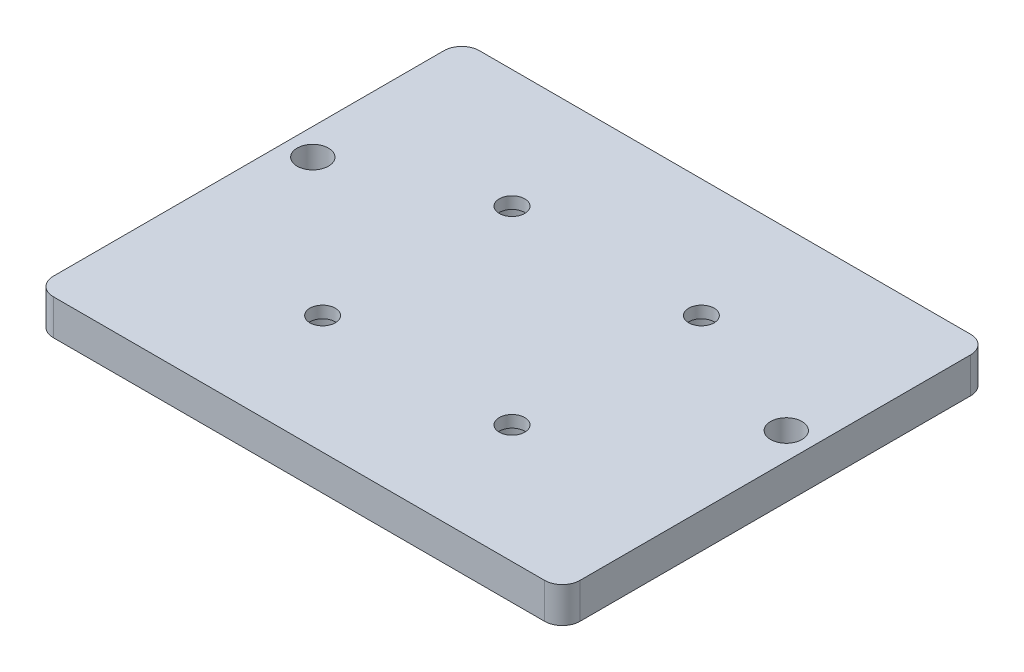
ISO-10303-21;
HEADER;
FILE_DESCRIPTION(('STEP AP214'),'2;1');
FILE_NAME('part.step','',(''),(''),'','','');
FILE_SCHEMA(('AUTOMOTIVE_DESIGN { 1 0 10303 214 1 1 1 1 }'));
ENDSEC;
DATA;
#1=APPLICATION_CONTEXT('core data for automotive mechanical design processes');
#2=APPLICATION_PROTOCOL_DEFINITION('international standard','automotive_design',2000,#1);
#3=PRODUCT_CONTEXT('',#1,'mechanical');
#4=PRODUCT('Part','Part','',(#3));
#5=PRODUCT_RELATED_PRODUCT_CATEGORY('part','',(#4));
#6=PRODUCT_DEFINITION_FORMATION('','',#4);
#7=PRODUCT_DEFINITION_CONTEXT('part definition',#1,'design');
#8=PRODUCT_DEFINITION('design','',#6,#7);
#9=PRODUCT_DEFINITION_SHAPE('','',#8);
#10=(LENGTH_UNIT() NAMED_UNIT(*) SI_UNIT(.MILLI.,.METRE.));
#11=(NAMED_UNIT(*) PLANE_ANGLE_UNIT() SI_UNIT($,.RADIAN.));
#12=(NAMED_UNIT(*) SI_UNIT($,.STERADIAN.) SOLID_ANGLE_UNIT());
#13=UNCERTAINTY_MEASURE_WITH_UNIT(LENGTH_MEASURE(1.E-05),#10,'distance_accuracy_value','');
#14=(GEOMETRIC_REPRESENTATION_CONTEXT(3) GLOBAL_UNCERTAINTY_ASSIGNED_CONTEXT((#13)) GLOBAL_UNIT_ASSIGNED_CONTEXT((#10,
#11,#12)) REPRESENTATION_CONTEXT('',''));
#15=CARTESIAN_POINT('',(0.,0.,0.));
#16=DIRECTION('',(0.,0.,1.));
#17=DIRECTION('',(1.,0.,0.));
#18=AXIS2_PLACEMENT_3D('',#15,#16,#17);
#19=CARTESIAN_POINT('',(0.,0.,0.));
#20=DIRECTION('',(0.,1.,0.));
#21=DIRECTION('',(0.,0.,1.));
#22=AXIS2_PLACEMENT_3D('',#19,#20,#21);
#23=PLANE('',#22);
#24=CARTESIAN_POINT('',(-40.,0.,-6.34428877022472));
#25=DIRECTION('',(0.,1.,0.));
#26=DIRECTION('',(0.,0.,1.));
#27=AXIS2_PLACEMENT_3D('',#24,#25,#26);
#28=CIRCLE('',#27,2.65);
#29=CARTESIAN_POINT('',(-40.,0.,-3.69428877022472));
#30=VERTEX_POINT('',#29);
#31=EDGE_CURVE('E228',#30,#30,#28,.T.);
#32=ORIENTED_EDGE('',*,*,#31,.T.);
#33=EDGE_LOOP('',(#32));
#34=FACE_BOUND('',#33,.T.);
#35=CARTESIAN_POINT('',(40.,0.,-6.34428877022472));
#36=DIRECTION('',(0.,1.,0.));
#37=DIRECTION('',(0.,0.,1.));
#38=AXIS2_PLACEMENT_3D('',#35,#36,#37);
#39=CIRCLE('',#38,2.65);
#40=CARTESIAN_POINT('',(40.,0.,-3.69428877022472));
#41=VERTEX_POINT('',#40);
#42=EDGE_CURVE('E222',#41,#41,#39,.T.);
#43=ORIENTED_EDGE('',*,*,#42,.T.);
#44=EDGE_LOOP('',(#43));
#45=FACE_BOUND('',#44,.T.);
#46=CARTESIAN_POINT('',(-16.,0.,-16.));
#47=DIRECTION('',(0.,-1.,0.));
#48=DIRECTION('',(0.,0.,-1.));
#49=AXIS2_PLACEMENT_3D('',#46,#47,#48);
#50=CIRCLE('',#49,4.);
#51=CARTESIAN_POINT('',(-16.,0.,-20.));
#52=VERTEX_POINT('',#51);
#53=EDGE_CURVE('E195',#52,#52,#50,.T.);
#54=ORIENTED_EDGE('',*,*,#53,.F.);
#55=EDGE_LOOP('',(#54));
#56=FACE_BOUND('',#55,.T.);
#57=CARTESIAN_POINT('',(-16.,0.,16.));
#58=DIRECTION('',(0.,-1.,0.));
#59=DIRECTION('',(0.,0.,-1.));
#60=AXIS2_PLACEMENT_3D('',#57,#58,#59);
#61=CIRCLE('',#60,4.);
#62=CARTESIAN_POINT('',(-16.,0.,12.));
#63=VERTEX_POINT('',#62);
#64=EDGE_CURVE('E183',#63,#63,#61,.T.);
#65=ORIENTED_EDGE('',*,*,#64,.F.);
#66=EDGE_LOOP('',(#65));
#67=FACE_BOUND('',#66,.T.);
#68=DIRECTION('',(-1.,0.,0.));
#69=VECTOR('',#68,1.);
#70=CARTESIAN_POINT('',(-44.5,0.,-36.));
#71=LINE('',#70,#69);
#72=CARTESIAN_POINT('',(41.5,0.,-36.));
#73=VERTEX_POINT('',#72);
#74=CARTESIAN_POINT('',(-41.5,0.,-36.));
#75=VERTEX_POINT('',#74);
#76=EDGE_CURVE('E120',#73,#75,#71,.T.);
#77=ORIENTED_EDGE('',*,*,#76,.F.);
#78=CARTESIAN_POINT('',(41.5,0.,-33.));
#79=DIRECTION('',(0.,1.,0.));
#80=DIRECTION('',(0.,0.,1.));
#81=AXIS2_PLACEMENT_3D('',#78,#79,#80);
#82=CIRCLE('',#81,3.);
#83=CARTESIAN_POINT('',(44.5,0.,-33.));
#84=VERTEX_POINT('',#83);
#85=EDGE_CURVE('E103',#73,#84,#82,.F.);
#86=ORIENTED_EDGE('',*,*,#85,.T.);
#87=DIRECTION('',(0.,0.,-1.));
#88=VECTOR('',#87,1.);
#89=CARTESIAN_POINT('',(44.5,0.,-36.));
#90=LINE('',#89,#88);
#91=CARTESIAN_POINT('',(44.5,0.,33.));
#92=VERTEX_POINT('',#91);
#93=EDGE_CURVE('E130',#92,#84,#90,.T.);
#94=ORIENTED_EDGE('',*,*,#93,.F.);
#95=CARTESIAN_POINT('',(41.5,0.,33.));
#96=DIRECTION('',(0.,1.,0.));
#97=DIRECTION('',(0.,0.,1.));
#98=AXIS2_PLACEMENT_3D('',#95,#96,#97);
#99=CIRCLE('',#98,3.);
#100=CARTESIAN_POINT('',(41.5,0.,36.));
#101=VERTEX_POINT('',#100);
#102=EDGE_CURVE('E114',#92,#101,#99,.F.);
#103=ORIENTED_EDGE('',*,*,#102,.T.);
#104=DIRECTION('',(1.,0.,0.));
#105=VECTOR('',#104,1.);
#106=CARTESIAN_POINT('',(-44.5,0.,36.));
#107=LINE('',#106,#105);
#108=CARTESIAN_POINT('',(-41.5,0.,36.));
#109=VERTEX_POINT('',#108);
#110=EDGE_CURVE('E134',#109,#101,#107,.T.);
#111=ORIENTED_EDGE('',*,*,#110,.F.);
#112=CARTESIAN_POINT('',(-41.5,0.,33.));
#113=DIRECTION('',(0.,1.,0.));
#114=DIRECTION('',(0.,0.,1.));
#115=AXIS2_PLACEMENT_3D('',#112,#113,#114);
#116=CIRCLE('',#115,3.);
#117=CARTESIAN_POINT('',(-44.5,0.,33.));
#118=VERTEX_POINT('',#117);
#119=EDGE_CURVE('E140',#109,#118,#116,.F.);
#120=ORIENTED_EDGE('',*,*,#119,.T.);
#121=DIRECTION('',(0.,0.,1.));
#122=VECTOR('',#121,1.);
#123=CARTESIAN_POINT('',(-44.5,0.,-36.));
#124=LINE('',#123,#122);
#125=CARTESIAN_POINT('',(-44.5,0.,-33.));
#126=VERTEX_POINT('',#125);
#127=EDGE_CURVE('E162',#126,#118,#124,.T.);
#128=ORIENTED_EDGE('',*,*,#127,.F.);
#129=CARTESIAN_POINT('',(-41.5,0.,-33.));
#130=DIRECTION('',(0.,1.,0.));
#131=DIRECTION('',(0.,0.,1.));
#132=AXIS2_PLACEMENT_3D('',#129,#130,#131);
#133=CIRCLE('',#132,3.);
#134=EDGE_CURVE('E124',#126,#75,#133,.F.);
#135=ORIENTED_EDGE('',*,*,#134,.T.);
#136=EDGE_LOOP('',(#77,#86,#94,#103,#111,#120,#128,#135));
#137=FACE_BOUND('',#136,.T.);
#138=CARTESIAN_POINT('',(16.,0.,-16.));
#139=DIRECTION('',(0.,-1.,0.));
#140=DIRECTION('',(0.,0.,-1.));
#141=AXIS2_PLACEMENT_3D('',#138,#139,#140);
#142=CIRCLE('',#141,4.);
#143=CARTESIAN_POINT('',(16.,0.,-20.));
#144=VERTEX_POINT('',#143);
#145=EDGE_CURVE('E207',#144,#144,#142,.T.);
#146=ORIENTED_EDGE('',*,*,#145,.F.);
#147=EDGE_LOOP('',(#146));
#148=FACE_BOUND('',#147,.T.);
#149=CARTESIAN_POINT('',(16.,0.,16.));
#150=DIRECTION('',(0.,-1.,0.));
#151=DIRECTION('',(0.,0.,-1.));
#152=AXIS2_PLACEMENT_3D('',#149,#150,#151);
#153=CIRCLE('',#152,4.);
#154=CARTESIAN_POINT('',(16.,0.,12.));
#155=VERTEX_POINT('',#154);
#156=EDGE_CURVE('E219',#155,#155,#153,.T.);
#157=ORIENTED_EDGE('',*,*,#156,.F.);
#158=EDGE_LOOP('',(#157));
#159=FACE_BOUND('',#158,.T.);
#160=ADVANCED_FACE('F37',(#34,#45,#56,#67,#137,#148,#159),#23,.F.);
#161=CARTESIAN_POINT('',(-44.5,6.,-36.));
#162=DIRECTION('',(1.,0.,0.));
#163=DIRECTION('',(0.,0.,-1.));
#164=AXIS2_PLACEMENT_3D('',#161,#162,#163);
#165=PLANE('',#164);
#166=ORIENTED_EDGE('',*,*,#127,.T.);
#167=DIRECTION('',(0.,-1.,0.));
#168=VECTOR('',#167,1.);
#169=CARTESIAN_POINT('',(-44.5,6.,33.));
#170=LINE('',#169,#168);
#171=CARTESIAN_POINT('',(-44.5,6.,33.));
#172=VERTEX_POINT('',#171);
#173=EDGE_CURVE('E11',#118,#172,#170,.F.);
#174=ORIENTED_EDGE('',*,*,#173,.T.);
#175=DIRECTION('',(0.,0.,1.));
#176=VECTOR('',#175,1.);
#177=CARTESIAN_POINT('',(-44.5,6.,-36.));
#178=LINE('',#177,#176);
#179=CARTESIAN_POINT('',(-44.5,6.,-33.));
#180=VERTEX_POINT('',#179);
#181=EDGE_CURVE('E129',#180,#172,#178,.T.);
#182=ORIENTED_EDGE('',*,*,#181,.F.);
#183=DIRECTION('',(0.,-1.,0.));
#184=VECTOR('',#183,1.);
#185=CARTESIAN_POINT('',(-44.5,6.,-33.));
#186=LINE('',#185,#184);
#187=EDGE_CURVE('E45',#180,#126,#186,.T.);
#188=ORIENTED_EDGE('',*,*,#187,.T.);
#189=EDGE_LOOP('',(#166,#174,#182,#188));
#190=FACE_BOUND('',#189,.T.);
#191=ADVANCED_FACE('F161',(#190),#165,.F.);
#192=CARTESIAN_POINT('',(-44.5,6.,36.));
#193=DIRECTION('',(0.,0.,-1.));
#194=DIRECTION('',(-1.,0.,0.));
#195=AXIS2_PLACEMENT_3D('',#192,#193,#194);
#196=PLANE('',#195);
#197=ORIENTED_EDGE('',*,*,#110,.T.);
#198=DIRECTION('',(0.,-1.,0.));
#199=VECTOR('',#198,1.);
#200=CARTESIAN_POINT('',(41.5,6.,36.));
#201=LINE('',#200,#199);
#202=CARTESIAN_POINT('',(41.5,6.,36.));
#203=VERTEX_POINT('',#202);
#204=EDGE_CURVE('E52',#101,#203,#201,.F.);
#205=ORIENTED_EDGE('',*,*,#204,.T.);
#206=DIRECTION('',(1.,0.,0.));
#207=VECTOR('',#206,1.);
#208=CARTESIAN_POINT('',(-44.5,6.,36.));
#209=LINE('',#208,#207);
#210=CARTESIAN_POINT('',(-41.5,6.,36.));
#211=VERTEX_POINT('',#210);
#212=EDGE_CURVE('E132',#211,#203,#209,.T.);
#213=ORIENTED_EDGE('',*,*,#212,.F.);
#214=DIRECTION('',(0.,-1.,0.));
#215=VECTOR('',#214,1.);
#216=CARTESIAN_POINT('',(-41.5,6.,36.));
#217=LINE('',#216,#215);
#218=EDGE_CURVE('E153',#211,#109,#217,.T.);
#219=ORIENTED_EDGE('',*,*,#218,.T.);
#220=EDGE_LOOP('',(#197,#205,#213,#219));
#221=FACE_BOUND('',#220,.T.);
#222=ADVANCED_FACE('F258',(#221),#196,.F.);
#223=CARTESIAN_POINT('',(44.5,6.,-36.));
#224=DIRECTION('',(-1.,0.,0.));
#225=DIRECTION('',(0.,0.,1.));
#226=AXIS2_PLACEMENT_3D('',#223,#224,#225);
#227=PLANE('',#226);
#228=ORIENTED_EDGE('',*,*,#93,.T.);
#229=DIRECTION('',(0.,-1.,0.));
#230=VECTOR('',#229,1.);
#231=CARTESIAN_POINT('',(44.5,6.,-33.));
#232=LINE('',#231,#230);
#233=CARTESIAN_POINT('',(44.5,6.,-33.));
#234=VERTEX_POINT('',#233);
#235=EDGE_CURVE('E108',#84,#234,#232,.F.);
#236=ORIENTED_EDGE('',*,*,#235,.T.);
#237=DIRECTION('',(0.,0.,-1.));
#238=VECTOR('',#237,1.);
#239=CARTESIAN_POINT('',(44.5,6.,-36.));
#240=LINE('',#239,#238);
#241=CARTESIAN_POINT('',(44.5,6.,33.));
#242=VERTEX_POINT('',#241);
#243=EDGE_CURVE('E174',#242,#234,#240,.T.);
#244=ORIENTED_EDGE('',*,*,#243,.F.);
#245=DIRECTION('',(0.,-1.,0.));
#246=VECTOR('',#245,1.);
#247=CARTESIAN_POINT('',(44.5,6.,33.));
#248=LINE('',#247,#246);
#249=EDGE_CURVE('E113',#242,#92,#248,.T.);
#250=ORIENTED_EDGE('',*,*,#249,.T.);
#251=EDGE_LOOP('',(#228,#236,#244,#250));
#252=FACE_BOUND('',#251,.T.);
#253=ADVANCED_FACE('F255',(#252),#227,.F.);
#254=CARTESIAN_POINT('',(-44.5,6.,-36.));
#255=DIRECTION('',(0.,0.,1.));
#256=DIRECTION('',(1.,0.,0.));
#257=AXIS2_PLACEMENT_3D('',#254,#255,#256);
#258=PLANE('',#257);
#259=DIRECTION('',(-1.,0.,0.));
#260=VECTOR('',#259,1.);
#261=CARTESIAN_POINT('',(-44.5,6.,-36.));
#262=LINE('',#261,#260);
#263=CARTESIAN_POINT('',(41.5,6.,-36.));
#264=VERTEX_POINT('',#263);
#265=CARTESIAN_POINT('',(-41.5,6.,-36.));
#266=VERTEX_POINT('',#265);
#267=EDGE_CURVE('E123',#264,#266,#262,.T.);
#268=ORIENTED_EDGE('',*,*,#267,.F.);
#269=DIRECTION('',(0.,-1.,0.));
#270=VECTOR('',#269,1.);
#271=CARTESIAN_POINT('',(41.5,6.,-36.));
#272=LINE('',#271,#270);
#273=EDGE_CURVE('E107',#264,#73,#272,.T.);
#274=ORIENTED_EDGE('',*,*,#273,.T.);
#275=ORIENTED_EDGE('',*,*,#76,.T.);
#276=DIRECTION('',(0.,-1.,0.));
#277=VECTOR('',#276,1.);
#278=CARTESIAN_POINT('',(-41.5,6.,-36.));
#279=LINE('',#278,#277);
#280=EDGE_CURVE('E125',#75,#266,#279,.F.);
#281=ORIENTED_EDGE('',*,*,#280,.T.);
#282=EDGE_LOOP('',(#268,#274,#275,#281));
#283=FACE_BOUND('',#282,.T.);
#284=ADVANCED_FACE('F119',(#283),#258,.F.);
#285=CARTESIAN_POINT('',(0.,6.,0.));
#286=DIRECTION('',(0.,1.,0.));
#287=DIRECTION('',(0.,0.,1.));
#288=AXIS2_PLACEMENT_3D('',#285,#286,#287);
#289=PLANE('',#288);
#290=CARTESIAN_POINT('',(-40.,6.,-6.34428877022472));
#291=DIRECTION('',(0.,1.,0.));
#292=DIRECTION('',(0.,0.,1.));
#293=AXIS2_PLACEMENT_3D('',#290,#291,#292);
#294=CIRCLE('',#293,2.65);
#295=CARTESIAN_POINT('',(-40.,6.,-3.69428877022472));
#296=VERTEX_POINT('',#295);
#297=EDGE_CURVE('E231',#296,#296,#294,.T.);
#298=ORIENTED_EDGE('',*,*,#297,.F.);
#299=EDGE_LOOP('',(#298));
#300=FACE_BOUND('',#299,.T.);
#301=CARTESIAN_POINT('',(40.,6.,-6.34428877022472));
#302=DIRECTION('',(0.,1.,0.));
#303=DIRECTION('',(0.,0.,1.));
#304=AXIS2_PLACEMENT_3D('',#301,#302,#303);
#305=CIRCLE('',#304,2.65);
#306=CARTESIAN_POINT('',(40.,6.,-3.69428877022472));
#307=VERTEX_POINT('',#306);
#308=EDGE_CURVE('E225',#307,#307,#305,.T.);
#309=ORIENTED_EDGE('',*,*,#308,.F.);
#310=EDGE_LOOP('',(#309));
#311=FACE_BOUND('',#310,.T.);
#312=CARTESIAN_POINT('',(16.,6.,16.));
#313=DIRECTION('',(0.,1.,0.));
#314=DIRECTION('',(0.,0.,1.));
#315=AXIS2_PLACEMENT_3D('',#312,#313,#314);
#316=CIRCLE('',#315,2.15);
#317=CARTESIAN_POINT('',(16.,6.,18.15));
#318=VERTEX_POINT('',#317);
#319=EDGE_CURVE('E210',#318,#318,#316,.T.);
#320=ORIENTED_EDGE('',*,*,#319,.F.);
#321=EDGE_LOOP('',(#320));
#322=FACE_BOUND('',#321,.T.);
#323=CARTESIAN_POINT('',(16.,6.,-16.));
#324=DIRECTION('',(0.,1.,0.));
#325=DIRECTION('',(0.,0.,1.));
#326=AXIS2_PLACEMENT_3D('',#323,#324,#325);
#327=CIRCLE('',#326,2.15);
#328=CARTESIAN_POINT('',(16.,6.,-13.85));
#329=VERTEX_POINT('',#328);
#330=EDGE_CURVE('E198',#329,#329,#327,.T.);
#331=ORIENTED_EDGE('',*,*,#330,.F.);
#332=EDGE_LOOP('',(#331));
#333=FACE_BOUND('',#332,.T.);
#334=CARTESIAN_POINT('',(-16.,6.,-16.));
#335=DIRECTION('',(0.,1.,0.));
#336=DIRECTION('',(0.,0.,1.));
#337=AXIS2_PLACEMENT_3D('',#334,#335,#336);
#338=CIRCLE('',#337,2.15);
#339=CARTESIAN_POINT('',(-16.,6.,-13.85));
#340=VERTEX_POINT('',#339);
#341=EDGE_CURVE('E186',#340,#340,#338,.T.);
#342=ORIENTED_EDGE('',*,*,#341,.F.);
#343=EDGE_LOOP('',(#342));
#344=FACE_BOUND('',#343,.T.);
#345=CARTESIAN_POINT('',(-16.,6.,16.));
#346=DIRECTION('',(0.,1.,0.));
#347=DIRECTION('',(0.,0.,1.));
#348=AXIS2_PLACEMENT_3D('',#345,#346,#347);
#349=CIRCLE('',#348,2.15);
#350=CARTESIAN_POINT('',(-16.,6.,18.15));
#351=VERTEX_POINT('',#350);
#352=EDGE_CURVE('E167',#351,#351,#349,.T.);
#353=ORIENTED_EDGE('',*,*,#352,.F.);
#354=EDGE_LOOP('',(#353));
#355=FACE_BOUND('',#354,.T.);
#356=ORIENTED_EDGE('',*,*,#243,.T.);
#357=CARTESIAN_POINT('',(41.5,6.,-33.));
#358=DIRECTION('',(0.,1.,0.));
#359=DIRECTION('',(0.,0.,1.));
#360=AXIS2_PLACEMENT_3D('',#357,#358,#359);
#361=CIRCLE('',#360,3.);
#362=EDGE_CURVE('E151',#234,#264,#361,.T.);
#363=ORIENTED_EDGE('',*,*,#362,.T.);
#364=ORIENTED_EDGE('',*,*,#267,.T.);
#365=CARTESIAN_POINT('',(-41.5,6.,-33.));
#366=DIRECTION('',(0.,1.,0.));
#367=DIRECTION('',(0.,0.,1.));
#368=AXIS2_PLACEMENT_3D('',#365,#366,#367);
#369=CIRCLE('',#368,3.);
#370=EDGE_CURVE('E146',#266,#180,#369,.T.);
#371=ORIENTED_EDGE('',*,*,#370,.T.);
#372=ORIENTED_EDGE('',*,*,#181,.T.);
#373=CARTESIAN_POINT('',(-41.5,6.,33.));
#374=DIRECTION('',(0.,1.,0.));
#375=DIRECTION('',(0.,0.,1.));
#376=AXIS2_PLACEMENT_3D('',#373,#374,#375);
#377=CIRCLE('',#376,3.);
#378=EDGE_CURVE('E59',#172,#211,#377,.T.);
#379=ORIENTED_EDGE('',*,*,#378,.T.);
#380=ORIENTED_EDGE('',*,*,#212,.T.);
#381=CARTESIAN_POINT('',(41.5,6.,33.));
#382=DIRECTION('',(0.,1.,0.));
#383=DIRECTION('',(0.,0.,1.));
#384=AXIS2_PLACEMENT_3D('',#381,#382,#383);
#385=CIRCLE('',#384,3.);
#386=EDGE_CURVE('E149',#203,#242,#385,.T.);
#387=ORIENTED_EDGE('',*,*,#386,.T.);
#388=EDGE_LOOP('',(#356,#363,#364,#371,#372,#379,#380,#387));
#389=FACE_BOUND('',#388,.T.);
#390=ADVANCED_FACE('F237',(#300,#311,#322,#333,#344,#355,#389),#289,.T.);
#391=CARTESIAN_POINT('',(-16.,0.,16.));
#392=DIRECTION('',(0.,-1.,0.));
#393=DIRECTION('',(0.,0.,-1.));
#394=AXIS2_PLACEMENT_3D('',#391,#392,#393);
#395=CYLINDRICAL_SURFACE('',#394,2.15);
#396=CARTESIAN_POINT('',(-16.,4.,16.));
#397=DIRECTION('',(0.,-1.,0.));
#398=DIRECTION('',(0.,0.,-1.));
#399=AXIS2_PLACEMENT_3D('',#396,#397,#398);
#400=CIRCLE('',#399,2.15);
#401=CARTESIAN_POINT('',(-16.,4.,13.85));
#402=VERTEX_POINT('',#401);
#403=EDGE_CURVE('E170',#402,#402,#400,.T.);
#404=ORIENTED_EDGE('',*,*,#403,.T.);
#405=EDGE_LOOP('',(#404));
#406=FACE_BOUND('',#405,.T.);
#407=ORIENTED_EDGE('',*,*,#352,.T.);
#408=EDGE_LOOP('',(#407));
#409=FACE_BOUND('',#408,.T.);
#410=ADVANCED_FACE('F240',(#406,#409),#395,.F.);
#411=CARTESIAN_POINT('',(-13.85,4.,16.));
#412=DIRECTION('',(0.,1.,0.));
#413=DIRECTION('',(0.,0.,1.));
#414=AXIS2_PLACEMENT_3D('',#411,#412,#413);
#415=PLANE('',#414);
#416=ORIENTED_EDGE('',*,*,#403,.F.);
#417=EDGE_LOOP('',(#416));
#418=FACE_BOUND('',#417,.T.);
#419=CARTESIAN_POINT('',(-16.,4.,16.));
#420=DIRECTION('',(0.,-1.,0.));
#421=DIRECTION('',(0.,0.,-1.));
#422=AXIS2_PLACEMENT_3D('',#419,#420,#421);
#423=CIRCLE('',#422,4.);
#424=CARTESIAN_POINT('',(-16.,4.,12.));
#425=VERTEX_POINT('',#424);
#426=EDGE_CURVE('E180',#425,#425,#423,.T.);
#427=ORIENTED_EDGE('',*,*,#426,.T.);
#428=EDGE_LOOP('',(#427));
#429=FACE_BOUND('',#428,.T.);
#430=ADVANCED_FACE('F429',(#418,#429),#415,.F.);
#431=CARTESIAN_POINT('',(-16.,0.,16.));
#432=DIRECTION('',(0.,-1.,0.));
#433=DIRECTION('',(0.,0.,-1.));
#434=AXIS2_PLACEMENT_3D('',#431,#432,#433);
#435=CYLINDRICAL_SURFACE('',#434,4.);
#436=ORIENTED_EDGE('',*,*,#426,.F.);
#437=EDGE_LOOP('',(#436));
#438=FACE_BOUND('',#437,.T.);
#439=ORIENTED_EDGE('',*,*,#64,.T.);
#440=EDGE_LOOP('',(#439));
#441=FACE_BOUND('',#440,.T.);
#442=ADVANCED_FACE('F419',(#438,#441),#435,.F.);
#443=CARTESIAN_POINT('',(-16.,0.,-16.));
#444=DIRECTION('',(0.,-1.,0.));
#445=DIRECTION('',(0.,0.,-1.));
#446=AXIS2_PLACEMENT_3D('',#443,#444,#445);
#447=CYLINDRICAL_SURFACE('',#446,2.15);
#448=CARTESIAN_POINT('',(-16.,4.,-16.));
#449=DIRECTION('',(0.,-1.,0.));
#450=DIRECTION('',(0.,0.,-1.));
#451=AXIS2_PLACEMENT_3D('',#448,#449,#450);
#452=CIRCLE('',#451,2.15);
#453=CARTESIAN_POINT('',(-16.,4.,-18.15));
#454=VERTEX_POINT('',#453);
#455=EDGE_CURVE('E189',#454,#454,#452,.T.);
#456=ORIENTED_EDGE('',*,*,#455,.T.);
#457=EDGE_LOOP('',(#456));
#458=FACE_BOUND('',#457,.T.);
#459=ORIENTED_EDGE('',*,*,#341,.T.);
#460=EDGE_LOOP('',(#459));
#461=FACE_BOUND('',#460,.T.);
#462=ADVANCED_FACE('F409',(#458,#461),#447,.F.);
#463=CARTESIAN_POINT('',(-13.85,4.,-16.));
#464=DIRECTION('',(0.,1.,0.));
#465=DIRECTION('',(0.,0.,1.));
#466=AXIS2_PLACEMENT_3D('',#463,#464,#465);
#467=PLANE('',#466);
#468=ORIENTED_EDGE('',*,*,#455,.F.);
#469=EDGE_LOOP('',(#468));
#470=FACE_BOUND('',#469,.T.);
#471=CARTESIAN_POINT('',(-16.,4.,-16.));
#472=DIRECTION('',(0.,-1.,0.));
#473=DIRECTION('',(0.,0.,-1.));
#474=AXIS2_PLACEMENT_3D('',#471,#472,#473);
#475=CIRCLE('',#474,4.);
#476=CARTESIAN_POINT('',(-16.,4.,-20.));
#477=VERTEX_POINT('',#476);
#478=EDGE_CURVE('E192',#477,#477,#475,.T.);
#479=ORIENTED_EDGE('',*,*,#478,.T.);
#480=EDGE_LOOP('',(#479));
#481=FACE_BOUND('',#480,.T.);
#482=ADVANCED_FACE('F399',(#470,#481),#467,.F.);
#483=CARTESIAN_POINT('',(-16.,0.,-16.));
#484=DIRECTION('',(0.,-1.,0.));
#485=DIRECTION('',(0.,0.,-1.));
#486=AXIS2_PLACEMENT_3D('',#483,#484,#485);
#487=CYLINDRICAL_SURFACE('',#486,4.);
#488=ORIENTED_EDGE('',*,*,#478,.F.);
#489=EDGE_LOOP('',(#488));
#490=FACE_BOUND('',#489,.T.);
#491=ORIENTED_EDGE('',*,*,#53,.T.);
#492=EDGE_LOOP('',(#491));
#493=FACE_BOUND('',#492,.T.);
#494=ADVANCED_FACE('F389',(#490,#493),#487,.F.);
#495=CARTESIAN_POINT('',(16.,0.,-16.));
#496=DIRECTION('',(0.,-1.,0.));
#497=DIRECTION('',(0.,0.,-1.));
#498=AXIS2_PLACEMENT_3D('',#495,#496,#497);
#499=CYLINDRICAL_SURFACE('',#498,2.15);
#500=CARTESIAN_POINT('',(16.,4.,-16.));
#501=DIRECTION('',(0.,-1.,0.));
#502=DIRECTION('',(0.,0.,-1.));
#503=AXIS2_PLACEMENT_3D('',#500,#501,#502);
#504=CIRCLE('',#503,2.15);
#505=CARTESIAN_POINT('',(16.,4.,-18.15));
#506=VERTEX_POINT('',#505);
#507=EDGE_CURVE('E201',#506,#506,#504,.T.);
#508=ORIENTED_EDGE('',*,*,#507,.T.);
#509=EDGE_LOOP('',(#508));
#510=FACE_BOUND('',#509,.T.);
#511=ORIENTED_EDGE('',*,*,#330,.T.);
#512=EDGE_LOOP('',(#511));
#513=FACE_BOUND('',#512,.T.);
#514=ADVANCED_FACE('F379',(#510,#513),#499,.F.);
#515=CARTESIAN_POINT('',(18.15,4.,-16.));
#516=DIRECTION('',(0.,1.,0.));
#517=DIRECTION('',(0.,0.,1.));
#518=AXIS2_PLACEMENT_3D('',#515,#516,#517);
#519=PLANE('',#518);
#520=ORIENTED_EDGE('',*,*,#507,.F.);
#521=EDGE_LOOP('',(#520));
#522=FACE_BOUND('',#521,.T.);
#523=CARTESIAN_POINT('',(16.,4.,-16.));
#524=DIRECTION('',(0.,-1.,0.));
#525=DIRECTION('',(0.,0.,-1.));
#526=AXIS2_PLACEMENT_3D('',#523,#524,#525);
#527=CIRCLE('',#526,4.);
#528=CARTESIAN_POINT('',(16.,4.,-20.));
#529=VERTEX_POINT('',#528);
#530=EDGE_CURVE('E204',#529,#529,#527,.T.);
#531=ORIENTED_EDGE('',*,*,#530,.T.);
#532=EDGE_LOOP('',(#531));
#533=FACE_BOUND('',#532,.T.);
#534=ADVANCED_FACE('F369',(#522,#533),#519,.F.);
#535=CARTESIAN_POINT('',(16.,0.,-16.));
#536=DIRECTION('',(0.,-1.,0.));
#537=DIRECTION('',(0.,0.,-1.));
#538=AXIS2_PLACEMENT_3D('',#535,#536,#537);
#539=CYLINDRICAL_SURFACE('',#538,4.);
#540=ORIENTED_EDGE('',*,*,#530,.F.);
#541=EDGE_LOOP('',(#540));
#542=FACE_BOUND('',#541,.T.);
#543=ORIENTED_EDGE('',*,*,#145,.T.);
#544=EDGE_LOOP('',(#543));
#545=FACE_BOUND('',#544,.T.);
#546=ADVANCED_FACE('F359',(#542,#545),#539,.F.);
#547=CARTESIAN_POINT('',(16.,0.,16.));
#548=DIRECTION('',(0.,-1.,0.));
#549=DIRECTION('',(0.,0.,-1.));
#550=AXIS2_PLACEMENT_3D('',#547,#548,#549);
#551=CYLINDRICAL_SURFACE('',#550,2.15);
#552=CARTESIAN_POINT('',(16.,4.,16.));
#553=DIRECTION('',(0.,-1.,0.));
#554=DIRECTION('',(0.,0.,-1.));
#555=AXIS2_PLACEMENT_3D('',#552,#553,#554);
#556=CIRCLE('',#555,2.15);
#557=CARTESIAN_POINT('',(16.,4.,13.85));
#558=VERTEX_POINT('',#557);
#559=EDGE_CURVE('E213',#558,#558,#556,.T.);
#560=ORIENTED_EDGE('',*,*,#559,.T.);
#561=EDGE_LOOP('',(#560));
#562=FACE_BOUND('',#561,.T.);
#563=ORIENTED_EDGE('',*,*,#319,.T.);
#564=EDGE_LOOP('',(#563));
#565=FACE_BOUND('',#564,.T.);
#566=ADVANCED_FACE('F349',(#562,#565),#551,.F.);
#567=CARTESIAN_POINT('',(18.15,4.,16.));
#568=DIRECTION('',(0.,1.,0.));
#569=DIRECTION('',(0.,0.,1.));
#570=AXIS2_PLACEMENT_3D('',#567,#568,#569);
#571=PLANE('',#570);
#572=ORIENTED_EDGE('',*,*,#559,.F.);
#573=EDGE_LOOP('',(#572));
#574=FACE_BOUND('',#573,.T.);
#575=CARTESIAN_POINT('',(16.,4.,16.));
#576=DIRECTION('',(0.,-1.,0.));
#577=DIRECTION('',(0.,0.,-1.));
#578=AXIS2_PLACEMENT_3D('',#575,#576,#577);
#579=CIRCLE('',#578,4.);
#580=CARTESIAN_POINT('',(16.,4.,12.));
#581=VERTEX_POINT('',#580);
#582=EDGE_CURVE('E216',#581,#581,#579,.T.);
#583=ORIENTED_EDGE('',*,*,#582,.T.);
#584=EDGE_LOOP('',(#583));
#585=FACE_BOUND('',#584,.T.);
#586=ADVANCED_FACE('F339',(#574,#585),#571,.F.);
#587=CARTESIAN_POINT('',(16.,0.,16.));
#588=DIRECTION('',(0.,-1.,0.));
#589=DIRECTION('',(0.,0.,-1.));
#590=AXIS2_PLACEMENT_3D('',#587,#588,#589);
#591=CYLINDRICAL_SURFACE('',#590,4.);
#592=ORIENTED_EDGE('',*,*,#582,.F.);
#593=EDGE_LOOP('',(#592));
#594=FACE_BOUND('',#593,.T.);
#595=ORIENTED_EDGE('',*,*,#156,.T.);
#596=EDGE_LOOP('',(#595));
#597=FACE_BOUND('',#596,.T.);
#598=ADVANCED_FACE('F329',(#594,#597),#591,.F.);
#599=CARTESIAN_POINT('',(40.,6.,-6.34428877022472));
#600=DIRECTION('',(0.,1.,0.));
#601=DIRECTION('',(0.,0.,1.));
#602=AXIS2_PLACEMENT_3D('',#599,#600,#601);
#603=CYLINDRICAL_SURFACE('',#602,2.65);
#604=ORIENTED_EDGE('',*,*,#42,.F.);
#605=EDGE_LOOP('',(#604));
#606=FACE_BOUND('',#605,.T.);
#607=ORIENTED_EDGE('',*,*,#308,.T.);
#608=EDGE_LOOP('',(#607));
#609=FACE_BOUND('',#608,.T.);
#610=ADVANCED_FACE('F319',(#606,#609),#603,.F.);
#611=CARTESIAN_POINT('',(-40.,6.,-6.34428877022472));
#612=DIRECTION('',(0.,1.,0.));
#613=DIRECTION('',(0.,0.,1.));
#614=AXIS2_PLACEMENT_3D('',#611,#612,#613);
#615=CYLINDRICAL_SURFACE('',#614,2.65);
#616=ORIENTED_EDGE('',*,*,#31,.F.);
#617=EDGE_LOOP('',(#616));
#618=FACE_BOUND('',#617,.T.);
#619=ORIENTED_EDGE('',*,*,#297,.T.);
#620=EDGE_LOOP('',(#619));
#621=FACE_BOUND('',#620,.T.);
#622=ADVANCED_FACE('F235',(#618,#621),#615,.F.);
#623=CARTESIAN_POINT('',(41.5,6.,-33.));
#624=DIRECTION('',(0.,-1.,0.));
#625=DIRECTION('',(0.,0.,-1.));
#626=AXIS2_PLACEMENT_3D('',#623,#624,#625);
#627=CYLINDRICAL_SURFACE('',#626,3.);
#628=ORIENTED_EDGE('',*,*,#362,.F.);
#629=ORIENTED_EDGE('',*,*,#235,.F.);
#630=ORIENTED_EDGE('',*,*,#85,.F.);
#631=ORIENTED_EDGE('',*,*,#273,.F.);
#632=EDGE_LOOP('',(#628,#629,#630,#631));
#633=FACE_BOUND('',#632,.T.);
#634=ADVANCED_FACE('F106',(#633),#627,.T.);
#635=CARTESIAN_POINT('',(41.5,6.,33.));
#636=DIRECTION('',(0.,-1.,0.));
#637=DIRECTION('',(0.,0.,-1.));
#638=AXIS2_PLACEMENT_3D('',#635,#636,#637);
#639=CYLINDRICAL_SURFACE('',#638,3.);
#640=ORIENTED_EDGE('',*,*,#386,.F.);
#641=ORIENTED_EDGE('',*,*,#204,.F.);
#642=ORIENTED_EDGE('',*,*,#102,.F.);
#643=ORIENTED_EDGE('',*,*,#249,.F.);
#644=EDGE_LOOP('',(#640,#641,#642,#643));
#645=FACE_BOUND('',#644,.T.);
#646=ADVANCED_FACE('F257',(#645),#639,.T.);
#647=CARTESIAN_POINT('',(-41.5,6.,33.));
#648=DIRECTION('',(0.,-1.,0.));
#649=DIRECTION('',(0.,0.,-1.));
#650=AXIS2_PLACEMENT_3D('',#647,#648,#649);
#651=CYLINDRICAL_SURFACE('',#650,3.);
#652=ORIENTED_EDGE('',*,*,#378,.F.);
#653=ORIENTED_EDGE('',*,*,#173,.F.);
#654=ORIENTED_EDGE('',*,*,#119,.F.);
#655=ORIENTED_EDGE('',*,*,#218,.F.);
#656=EDGE_LOOP('',(#652,#653,#654,#655));
#657=FACE_BOUND('',#656,.T.);
#658=ADVANCED_FACE('F261',(#657),#651,.T.);
#659=CARTESIAN_POINT('',(-41.5,6.,-33.));
#660=DIRECTION('',(0.,-1.,0.));
#661=DIRECTION('',(0.,0.,-1.));
#662=AXIS2_PLACEMENT_3D('',#659,#660,#661);
#663=CYLINDRICAL_SURFACE('',#662,3.);
#664=ORIENTED_EDGE('',*,*,#370,.F.);
#665=ORIENTED_EDGE('',*,*,#280,.F.);
#666=ORIENTED_EDGE('',*,*,#134,.F.);
#667=ORIENTED_EDGE('',*,*,#187,.F.);
#668=EDGE_LOOP('',(#664,#665,#666,#667));
#669=FACE_BOUND('',#668,.T.);
#670=ADVANCED_FACE('F39',(#669),#663,.T.);
#671=CLOSED_SHELL('',(#160,#191,#222,#253,#284,#390,#410,#430,#442,#462,#482,#494,#514,#534,
#546,#566,#586,#598,#610,#622,#634,#646,#658,#670));
#672=MANIFOLD_SOLID_BREP('B2',#671);
#673=ADVANCED_BREP_SHAPE_REPRESENTATION('',(#18,#672),#14);
#674=SHAPE_DEFINITION_REPRESENTATION(#9,#673);
ENDSEC;
END-ISO-10303-21;
